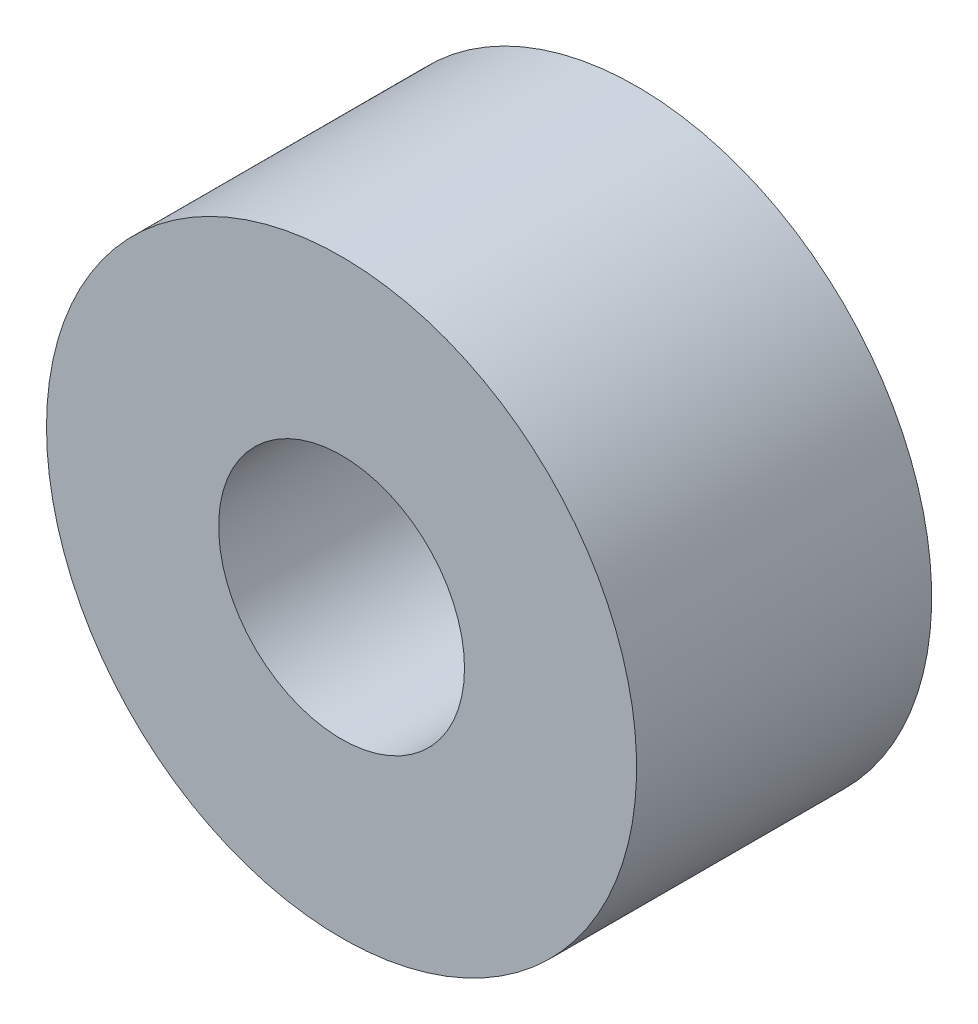
ISO-10303-21;
HEADER;
FILE_DESCRIPTION(('STEP AP214'),'2;1');
FILE_NAME('part.step','',(''),(''),'','','');
FILE_SCHEMA(('AUTOMOTIVE_DESIGN { 1 0 10303 214 1 1 1 1 }'));
ENDSEC;
DATA;
#1=APPLICATION_CONTEXT('core data for automotive mechanical design processes');
#2=APPLICATION_PROTOCOL_DEFINITION('international standard','automotive_design',2000,#1);
#3=PRODUCT_CONTEXT('',#1,'mechanical');
#4=PRODUCT('Part','Part','',(#3));
#5=PRODUCT_RELATED_PRODUCT_CATEGORY('part','',(#4));
#6=PRODUCT_DEFINITION_FORMATION('','',#4);
#7=PRODUCT_DEFINITION_CONTEXT('part definition',#1,'design');
#8=PRODUCT_DEFINITION('design','',#6,#7);
#9=PRODUCT_DEFINITION_SHAPE('','',#8);
#10=(LENGTH_UNIT() NAMED_UNIT(*) SI_UNIT(.MILLI.,.METRE.));
#11=(NAMED_UNIT(*) PLANE_ANGLE_UNIT() SI_UNIT($,.RADIAN.));
#12=(NAMED_UNIT(*) SI_UNIT($,.STERADIAN.) SOLID_ANGLE_UNIT());
#13=UNCERTAINTY_MEASURE_WITH_UNIT(LENGTH_MEASURE(1.E-05),#10,'distance_accuracy_value','');
#14=(GEOMETRIC_REPRESENTATION_CONTEXT(3) GLOBAL_UNCERTAINTY_ASSIGNED_CONTEXT((#13)) GLOBAL_UNIT_ASSIGNED_CONTEXT((#10,
#11,#12)) REPRESENTATION_CONTEXT('',''));
#15=CARTESIAN_POINT('',(0.,0.,0.));
#16=DIRECTION('',(0.,0.,1.));
#17=DIRECTION('',(1.,0.,0.));
#18=AXIS2_PLACEMENT_3D('',#15,#16,#17);
#19=CARTESIAN_POINT('',(0.,0.,19.05));
#20=DIRECTION('',(0.,0.,-1.));
#21=DIRECTION('',(-1.,0.,0.));
#22=AXIS2_PLACEMENT_3D('',#19,#20,#21);
#23=CYLINDRICAL_SURFACE('',#22,19.05);
#24=CARTESIAN_POINT('',(0.,0.,19.05));
#25=DIRECTION('',(0.,0.,1.));
#26=DIRECTION('',(1.,0.,0.));
#27=AXIS2_PLACEMENT_3D('',#24,#25,#26);
#28=CIRCLE('',#27,19.05);
#29=CARTESIAN_POINT('',(-19.05,0.,19.05));
#30=VERTEX_POINT('',#29);
#31=EDGE_CURVE('E10',#30,#30,#28,.T.);
#32=CARTESIAN_POINT('',(0.,0.,0.));
#33=DIRECTION('',(0.,0.,1.));
#34=DIRECTION('',(1.,0.,0.));
#35=AXIS2_PLACEMENT_3D('',#32,#33,#34);
#36=CIRCLE('',#35,19.05);
#37=CARTESIAN_POINT('',(-19.05,0.,0.));
#38=VERTEX_POINT('',#37);
#39=EDGE_CURVE('E34',#38,#38,#36,.T.);
#40=CARTESIAN_POINT('',(-19.05,0.,19.05));
#41=CARTESIAN_POINT('',(-19.05,0.,18.8515625));
#42=CARTESIAN_POINT('',(-19.05,0.,18.653125));
#43=CARTESIAN_POINT('',(-19.05,0.,18.25625));
#44=CARTESIAN_POINT('',(-19.05,0.,18.0578125));
#45=CARTESIAN_POINT('',(-19.05,0.,17.6609375));
#46=CARTESIAN_POINT('',(-19.05,0.,17.4625));
#47=CARTESIAN_POINT('',(-19.05,0.,17.065625));
#48=CARTESIAN_POINT('',(-19.05,0.,16.8671875));
#49=CARTESIAN_POINT('',(-19.05,0.,16.4703125));
#50=CARTESIAN_POINT('',(-19.05,0.,16.271875));
#51=CARTESIAN_POINT('',(-19.05,0.,15.875));
#52=CARTESIAN_POINT('',(-19.05,0.,15.6765625));
#53=CARTESIAN_POINT('',(-19.05,0.,15.2796875));
#54=CARTESIAN_POINT('',(-19.05,0.,15.08125));
#55=CARTESIAN_POINT('',(-19.05,0.,14.684375));
#56=CARTESIAN_POINT('',(-19.05,0.,14.4859375));
#57=CARTESIAN_POINT('',(-19.05,0.,14.0890625));
#58=CARTESIAN_POINT('',(-19.05,0.,13.890625));
#59=CARTESIAN_POINT('',(-19.05,0.,13.49375));
#60=CARTESIAN_POINT('',(-19.05,0.,13.2953125));
#61=CARTESIAN_POINT('',(-19.05,0.,12.8984375));
#62=CARTESIAN_POINT('',(-19.05,0.,12.7));
#63=CARTESIAN_POINT('',(-19.05,0.,12.303125));
#64=CARTESIAN_POINT('',(-19.05,0.,12.1046875));
#65=CARTESIAN_POINT('',(-19.05,0.,11.7078125));
#66=CARTESIAN_POINT('',(-19.05,0.,11.509375));
#67=CARTESIAN_POINT('',(-19.05,0.,11.1125));
#68=CARTESIAN_POINT('',(-19.05,0.,10.9140625));
#69=CARTESIAN_POINT('',(-19.05,0.,10.5171875));
#70=CARTESIAN_POINT('',(-19.05,0.,10.31875));
#71=CARTESIAN_POINT('',(-19.05,0.,9.921875));
#72=CARTESIAN_POINT('',(-19.05,0.,9.7234375));
#73=CARTESIAN_POINT('',(-19.05,0.,9.3265625));
#74=CARTESIAN_POINT('',(-19.05,0.,9.128125));
#75=CARTESIAN_POINT('',(-19.05,0.,8.73125));
#76=CARTESIAN_POINT('',(-19.05,0.,8.5328125));
#77=CARTESIAN_POINT('',(-19.05,0.,8.1359375));
#78=CARTESIAN_POINT('',(-19.05,0.,7.9375));
#79=CARTESIAN_POINT('',(-19.05,0.,7.540625));
#80=CARTESIAN_POINT('',(-19.05,0.,7.3421875));
#81=CARTESIAN_POINT('',(-19.05,0.,6.9453125));
#82=CARTESIAN_POINT('',(-19.05,0.,6.746875));
#83=CARTESIAN_POINT('',(-19.05,0.,6.35));
#84=CARTESIAN_POINT('',(-19.05,0.,6.1515625));
#85=CARTESIAN_POINT('',(-19.05,0.,5.7546875));
#86=CARTESIAN_POINT('',(-19.05,0.,5.55625));
#87=CARTESIAN_POINT('',(-19.05,0.,5.159375));
#88=CARTESIAN_POINT('',(-19.05,0.,4.9609375));
#89=CARTESIAN_POINT('',(-19.05,0.,4.5640625));
#90=CARTESIAN_POINT('',(-19.05,0.,4.365625));
#91=CARTESIAN_POINT('',(-19.05,0.,3.96875));
#92=CARTESIAN_POINT('',(-19.05,0.,3.7703125));
#93=CARTESIAN_POINT('',(-19.05,0.,3.3734375));
#94=CARTESIAN_POINT('',(-19.05,0.,3.175));
#95=CARTESIAN_POINT('',(-19.05,0.,2.778125));
#96=CARTESIAN_POINT('',(-19.05,0.,2.5796875));
#97=CARTESIAN_POINT('',(-19.05,0.,2.1828125));
#98=CARTESIAN_POINT('',(-19.05,0.,1.984375));
#99=CARTESIAN_POINT('',(-19.05,0.,1.5875));
#100=CARTESIAN_POINT('',(-19.05,0.,1.3890625));
#101=CARTESIAN_POINT('',(-19.05,0.,0.992187500000001));
#102=CARTESIAN_POINT('',(-19.05,0.,0.793750000000001));
#103=CARTESIAN_POINT('',(-19.05,0.,0.396875));
#104=CARTESIAN_POINT('',(-19.05,0.,0.1984375));
#105=CARTESIAN_POINT('',(-19.05,0.,0.));
#106=B_SPLINE_CURVE_WITH_KNOTS('',3,(#40,#41,#42,#43,#44,#45,#46,#47,#48,#49,#50,#51,#52,#53,
#54,#55,#56,#57,#58,#59,#60,#61,#62,#63,#64,#65,#66,#67,#68,#69,#70,#71,#72,#73,#74,#75,#76,#77,
#78,#79,#80,#81,#82,#83,#84,#85,#86,#87,#88,#89,#90,#91,#92,#93,#94,#95,#96,#97,#98,#99,#100,
#101,#102,#103,#104,#105),.UNSPECIFIED.,.F.,.F.,(4,2,2,2,2,2,2,2,2,2,2,2,2,2,2,2,2,2,2,2,2,2,2,
2,2,2,2,2,2,2,2,2,4),(0.,0.5953125,1.190625,1.7859375,2.38125,2.9765625,3.571875,4.1671875,
4.7625,5.3578125,5.953125,6.5484375,7.14375,7.7390625,8.334375,8.9296875,9.525,10.1203125,
10.715625,11.3109375,11.90625,12.5015625,13.096875,13.6921875,14.2875,14.8828125,15.478125,
16.0734375,16.66875,17.2640625,17.859375,18.4546875,19.05),.UNSPECIFIED.);
#107=EDGE_CURVE('BSEAM31',#30,#38,#106,.T.);
#108=ORIENTED_EDGE('',*,*,#31,.F.);
#109=ORIENTED_EDGE('',*,*,#39,.T.);
#110=ORIENTED_EDGE('',*,*,#107,.T.);
#111=ORIENTED_EDGE('',*,*,#107,.F.);
#112=EDGE_LOOP('',(#108,#110,#109,#111));
#113=FACE_BOUND('',#112,.T.);
#114=ADVANCED_FACE('F31',(#113),#23,.T.);
#115=CARTESIAN_POINT('',(0.,0.,19.05));
#116=DIRECTION('',(0.,0.,1.));
#117=DIRECTION('',(1.,0.,0.));
#118=AXIS2_PLACEMENT_3D('',#115,#116,#117);
#119=PLANE('',#118);
#120=CARTESIAN_POINT('',(0.,0.,19.05));
#121=DIRECTION('',(0.,0.,1.));
#122=DIRECTION('',(1.,0.,0.));
#123=AXIS2_PLACEMENT_3D('',#120,#121,#122);
#124=CIRCLE('',#123,7.9375);
#125=CARTESIAN_POINT('',(7.9375,0.,19.05));
#126=VERTEX_POINT('',#125);
#127=EDGE_CURVE('E43',#126,#126,#124,.T.);
#128=ORIENTED_EDGE('',*,*,#127,.F.);
#129=EDGE_LOOP('',(#128));
#130=FACE_BOUND('',#129,.T.);
#131=ORIENTED_EDGE('',*,*,#31,.T.);
#132=EDGE_LOOP('',(#131));
#133=FACE_BOUND('',#132,.T.);
#134=ADVANCED_FACE('F58',(#130,#133),#119,.T.);
#135=CARTESIAN_POINT('',(0.,0.,0.));
#136=DIRECTION('',(0.,0.,1.));
#137=DIRECTION('',(1.,0.,0.));
#138=AXIS2_PLACEMENT_3D('',#135,#136,#137);
#139=PLANE('',#138);
#140=CARTESIAN_POINT('',(0.,0.,0.));
#141=DIRECTION('',(0.,0.,1.));
#142=DIRECTION('',(1.,0.,0.));
#143=AXIS2_PLACEMENT_3D('',#140,#141,#142);
#144=CIRCLE('',#143,7.9375);
#145=CARTESIAN_POINT('',(7.9375,0.,0.));
#146=VERTEX_POINT('',#145);
#147=EDGE_CURVE('E41',#146,#146,#144,.T.);
#148=ORIENTED_EDGE('',*,*,#147,.T.);
#149=EDGE_LOOP('',(#148));
#150=FACE_BOUND('',#149,.T.);
#151=ORIENTED_EDGE('',*,*,#39,.F.);
#152=EDGE_LOOP('',(#151));
#153=FACE_BOUND('',#152,.T.);
#154=ADVANCED_FACE('F49',(#150,#153),#139,.F.);
#155=CARTESIAN_POINT('',(0.,0.,0.));
#156=DIRECTION('',(0.,0.,1.));
#157=DIRECTION('',(1.,0.,0.));
#158=AXIS2_PLACEMENT_3D('',#155,#156,#157);
#159=CYLINDRICAL_SURFACE('',#158,7.9375);
#160=CARTESIAN_POINT('',(7.9375,0.,0.));
#161=CARTESIAN_POINT('',(7.9375,0.,0.1984375));
#162=CARTESIAN_POINT('',(7.9375,0.,0.396875));
#163=CARTESIAN_POINT('',(7.9375,0.,0.79375));
#164=CARTESIAN_POINT('',(7.9375,0.,0.9921875));
#165=CARTESIAN_POINT('',(7.9375,0.,1.3890625));
#166=CARTESIAN_POINT('',(7.9375,0.,1.5875));
#167=CARTESIAN_POINT('',(7.9375,0.,1.984375));
#168=CARTESIAN_POINT('',(7.9375,0.,2.1828125));
#169=CARTESIAN_POINT('',(7.9375,0.,2.5796875));
#170=CARTESIAN_POINT('',(7.9375,0.,2.778125));
#171=CARTESIAN_POINT('',(7.9375,0.,3.175));
#172=CARTESIAN_POINT('',(7.9375,0.,3.3734375));
#173=CARTESIAN_POINT('',(7.9375,0.,3.7703125));
#174=CARTESIAN_POINT('',(7.9375,0.,3.96875));
#175=CARTESIAN_POINT('',(7.9375,0.,4.365625));
#176=CARTESIAN_POINT('',(7.9375,0.,4.5640625));
#177=CARTESIAN_POINT('',(7.9375,0.,4.9609375));
#178=CARTESIAN_POINT('',(7.9375,0.,5.159375));
#179=CARTESIAN_POINT('',(7.9375,0.,5.55625));
#180=CARTESIAN_POINT('',(7.9375,0.,5.7546875));
#181=CARTESIAN_POINT('',(7.9375,0.,6.1515625));
#182=CARTESIAN_POINT('',(7.9375,0.,6.35));
#183=CARTESIAN_POINT('',(7.9375,0.,6.746875));
#184=CARTESIAN_POINT('',(7.9375,0.,6.9453125));
#185=CARTESIAN_POINT('',(7.9375,0.,7.3421875));
#186=CARTESIAN_POINT('',(7.9375,0.,7.540625));
#187=CARTESIAN_POINT('',(7.9375,0.,7.9375));
#188=CARTESIAN_POINT('',(7.9375,0.,8.1359375));
#189=CARTESIAN_POINT('',(7.9375,0.,8.5328125));
#190=CARTESIAN_POINT('',(7.9375,0.,8.73125));
#191=CARTESIAN_POINT('',(7.9375,0.,9.128125));
#192=CARTESIAN_POINT('',(7.9375,0.,9.3265625));
#193=CARTESIAN_POINT('',(7.9375,0.,9.7234375));
#194=CARTESIAN_POINT('',(7.9375,0.,9.921875));
#195=CARTESIAN_POINT('',(7.9375,0.,10.31875));
#196=CARTESIAN_POINT('',(7.9375,0.,10.5171875));
#197=CARTESIAN_POINT('',(7.9375,0.,10.9140625));
#198=CARTESIAN_POINT('',(7.9375,0.,11.1125));
#199=CARTESIAN_POINT('',(7.9375,0.,11.509375));
#200=CARTESIAN_POINT('',(7.9375,0.,11.7078125));
#201=CARTESIAN_POINT('',(7.9375,0.,12.1046875));
#202=CARTESIAN_POINT('',(7.9375,0.,12.303125));
#203=CARTESIAN_POINT('',(7.9375,0.,12.7));
#204=CARTESIAN_POINT('',(7.9375,0.,12.8984375));
#205=CARTESIAN_POINT('',(7.9375,0.,13.2953125));
#206=CARTESIAN_POINT('',(7.9375,0.,13.49375));
#207=CARTESIAN_POINT('',(7.9375,0.,13.890625));
#208=CARTESIAN_POINT('',(7.9375,0.,14.0890625));
#209=CARTESIAN_POINT('',(7.9375,0.,14.4859375));
#210=CARTESIAN_POINT('',(7.9375,0.,14.684375));
#211=CARTESIAN_POINT('',(7.9375,0.,15.08125));
#212=CARTESIAN_POINT('',(7.9375,0.,15.2796875));
#213=CARTESIAN_POINT('',(7.9375,0.,15.6765625));
#214=CARTESIAN_POINT('',(7.9375,0.,15.875));
#215=CARTESIAN_POINT('',(7.9375,0.,16.271875));
#216=CARTESIAN_POINT('',(7.9375,0.,16.4703125));
#217=CARTESIAN_POINT('',(7.9375,0.,16.8671875));
#218=CARTESIAN_POINT('',(7.9375,0.,17.065625));
#219=CARTESIAN_POINT('',(7.9375,0.,17.4625));
#220=CARTESIAN_POINT('',(7.9375,0.,17.6609375));
#221=CARTESIAN_POINT('',(7.9375,0.,18.0578125));
#222=CARTESIAN_POINT('',(7.9375,0.,18.25625));
#223=CARTESIAN_POINT('',(7.9375,0.,18.653125));
#224=CARTESIAN_POINT('',(7.9375,0.,18.8515625));
#225=CARTESIAN_POINT('',(7.9375,0.,19.05));
#226=B_SPLINE_CURVE_WITH_KNOTS('',3,(#160,#161,#162,#163,#164,#165,#166,#167,#168,#169,#170,
#171,#172,#173,#174,#175,#176,#177,#178,#179,#180,#181,#182,#183,#184,#185,#186,#187,#188,#189,
#190,#191,#192,#193,#194,#195,#196,#197,#198,#199,#200,#201,#202,#203,#204,#205,#206,#207,#208,
#209,#210,#211,#212,#213,#214,#215,#216,#217,#218,#219,#220,#221,#222,#223,#224,#225),
.UNSPECIFIED.,.F.,.F.,(4,2,2,2,2,2,2,2,2,2,2,2,2,2,2,2,2,2,2,2,2,2,2,2,2,2,2,2,2,2,2,2,4),(0.,
0.5953125,1.190625,1.7859375,2.38125,2.9765625,3.571875,4.1671875,4.7625,5.3578125,5.953125,
6.5484375,7.14375,7.7390625,8.334375,8.9296875,9.525,10.1203125,10.715625,11.3109375,11.90625,
12.5015625,13.096875,13.6921875,14.2875,14.8828125,15.478125,16.0734375,16.66875,17.2640625,
17.859375,18.4546875,19.05),.UNSPECIFIED.);
#227=EDGE_CURVE('BSEAM52',#146,#126,#226,.T.);
#228=ORIENTED_EDGE('',*,*,#147,.F.);
#229=ORIENTED_EDGE('',*,*,#127,.T.);
#230=ORIENTED_EDGE('',*,*,#227,.T.);
#231=ORIENTED_EDGE('',*,*,#227,.F.);
#232=EDGE_LOOP('',(#228,#230,#229,#231));
#233=FACE_BOUND('',#232,.T.);
#234=ADVANCED_FACE('F52',(#233),#159,.F.);
#235=CLOSED_SHELL('',(#114,#134,#154,#234));
#236=MANIFOLD_SOLID_BREP('B2',#235);
#237=ADVANCED_BREP_SHAPE_REPRESENTATION('',(#18,#236),#14);
#238=SHAPE_DEFINITION_REPRESENTATION(#9,#237);
ENDSEC;
END-ISO-10303-21;
